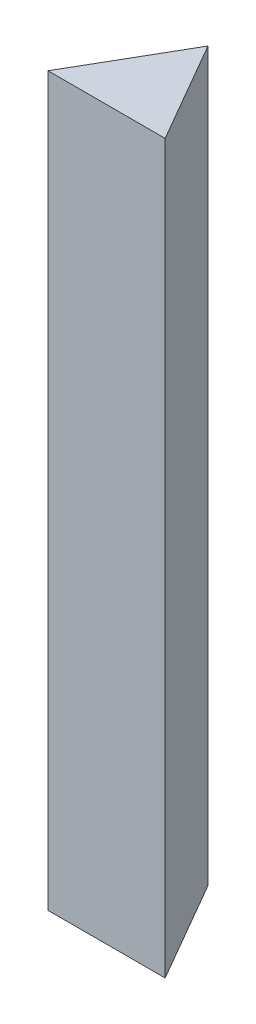
ISO-10303-21;
HEADER;
FILE_DESCRIPTION(('STEP AP214'),'2;1');
FILE_NAME('part.step','',(''),(''),'','','');
FILE_SCHEMA(('AUTOMOTIVE_DESIGN { 1 0 10303 214 1 1 1 1 }'));
ENDSEC;
DATA;
#1=APPLICATION_CONTEXT('core data for automotive mechanical design processes');
#2=APPLICATION_PROTOCOL_DEFINITION('international standard','automotive_design',2000,#1);
#3=PRODUCT_CONTEXT('',#1,'mechanical');
#4=PRODUCT('Part','Part','',(#3));
#5=PRODUCT_RELATED_PRODUCT_CATEGORY('part','',(#4));
#6=PRODUCT_DEFINITION_FORMATION('','',#4);
#7=PRODUCT_DEFINITION_CONTEXT('part definition',#1,'design');
#8=PRODUCT_DEFINITION('design','',#6,#7);
#9=PRODUCT_DEFINITION_SHAPE('','',#8);
#10=(LENGTH_UNIT() NAMED_UNIT(*) SI_UNIT(.MILLI.,.METRE.));
#11=(NAMED_UNIT(*) PLANE_ANGLE_UNIT() SI_UNIT($,.RADIAN.));
#12=(NAMED_UNIT(*) SI_UNIT($,.STERADIAN.) SOLID_ANGLE_UNIT());
#13=UNCERTAINTY_MEASURE_WITH_UNIT(LENGTH_MEASURE(1.E-05),#10,'distance_accuracy_value','');
#14=(GEOMETRIC_REPRESENTATION_CONTEXT(3) GLOBAL_UNCERTAINTY_ASSIGNED_CONTEXT((#13)) GLOBAL_UNIT_ASSIGNED_CONTEXT((#10,
#11,#12)) REPRESENTATION_CONTEXT('',''));
#15=CARTESIAN_POINT('',(0.,0.,0.));
#16=DIRECTION('',(0.,0.,1.));
#17=DIRECTION('',(1.,0.,0.));
#18=AXIS2_PLACEMENT_3D('',#15,#16,#17);
#19=CARTESIAN_POINT('',(2.4,29.8,0.));
#20=DIRECTION('',(0.,0.,-1.));
#21=DIRECTION('',(-1.,0.,0.));
#22=AXIS2_PLACEMENT_3D('',#19,#20,#21);
#23=PLANE('',#22);
#24=DIRECTION('',(1.,0.,0.));
#25=VECTOR('',#24,1.);
#26=CARTESIAN_POINT('',(2.4,0.,0.));
#27=LINE('',#26,#25);
#28=CARTESIAN_POINT('',(-2.4,0.,0.));
#29=VERTEX_POINT('',#28);
#30=CARTESIAN_POINT('',(2.4,0.,0.));
#31=VERTEX_POINT('',#30);
#32=EDGE_CURVE('E93',#29,#31,#27,.T.);
#33=ORIENTED_EDGE('',*,*,#32,.T.);
#34=DIRECTION('',(0.,-1.,0.));
#35=VECTOR('',#34,1.);
#36=CARTESIAN_POINT('',(2.4,29.8,0.));
#37=LINE('',#36,#35);
#38=CARTESIAN_POINT('',(2.4,29.8,0.));
#39=VERTEX_POINT('',#38);
#40=EDGE_CURVE('E11',#39,#31,#37,.T.);
#41=ORIENTED_EDGE('',*,*,#40,.F.);
#42=DIRECTION('',(1.,0.,0.));
#43=VECTOR('',#42,1.);
#44=CARTESIAN_POINT('',(2.4,29.8,0.));
#45=LINE('',#44,#43);
#46=CARTESIAN_POINT('',(-2.4,29.8,0.));
#47=VERTEX_POINT('',#46);
#48=EDGE_CURVE('E85',#47,#39,#45,.T.);
#49=ORIENTED_EDGE('',*,*,#48,.F.);
#50=DIRECTION('',(0.,-1.,0.));
#51=VECTOR('',#50,1.);
#52=CARTESIAN_POINT('',(-2.4,29.8,0.));
#53=LINE('',#52,#51);
#54=EDGE_CURVE('E94',#47,#29,#53,.T.);
#55=ORIENTED_EDGE('',*,*,#54,.T.);
#56=EDGE_LOOP('',(#33,#41,#49,#55));
#57=FACE_BOUND('',#56,.T.);
#58=ADVANCED_FACE('F43',(#57),#23,.F.);
#59=CARTESIAN_POINT('',(0.,29.8,-4.15692193816531));
#60=DIRECTION('',(-0.866025403784439,0.,0.5));
#61=DIRECTION('',(0.5,0.,0.866025403784439));
#62=AXIS2_PLACEMENT_3D('',#59,#60,#61);
#63=PLANE('',#62);
#64=DIRECTION('',(-0.5,0.,-0.866025403784439));
#65=VECTOR('',#64,1.);
#66=CARTESIAN_POINT('',(0.,0.,-4.15692193816531));
#67=LINE('',#66,#65);
#68=CARTESIAN_POINT('',(0.,0.,-4.15692193816531));
#69=VERTEX_POINT('',#68);
#70=EDGE_CURVE('E72',#31,#69,#67,.T.);
#71=ORIENTED_EDGE('',*,*,#70,.T.);
#72=DIRECTION('',(0.,-1.,0.));
#73=VECTOR('',#72,1.);
#74=CARTESIAN_POINT('',(0.,29.8,-4.15692193816531));
#75=LINE('',#74,#73);
#76=CARTESIAN_POINT('',(0.,29.8,-4.15692193816531));
#77=VERTEX_POINT('',#76);
#78=EDGE_CURVE('E52',#77,#69,#75,.T.);
#79=ORIENTED_EDGE('',*,*,#78,.F.);
#80=DIRECTION('',(-0.5,0.,-0.866025403784439));
#81=VECTOR('',#80,1.);
#82=CARTESIAN_POINT('',(0.,29.8,-4.15692193816531));
#83=LINE('',#82,#81);
#84=EDGE_CURVE('E80',#39,#77,#83,.T.);
#85=ORIENTED_EDGE('',*,*,#84,.F.);
#86=ORIENTED_EDGE('',*,*,#40,.T.);
#87=EDGE_LOOP('',(#71,#79,#85,#86));
#88=FACE_BOUND('',#87,.T.);
#89=ADVANCED_FACE('F81',(#88),#63,.F.);
#90=CARTESIAN_POINT('',(-2.4,29.8,0.));
#91=DIRECTION('',(0.866025403784439,0.,0.5));
#92=DIRECTION('',(0.5,0.,-0.866025403784439));
#93=AXIS2_PLACEMENT_3D('',#90,#91,#92);
#94=PLANE('',#93);
#95=DIRECTION('',(-0.5,0.,0.866025403784439));
#96=VECTOR('',#95,1.);
#97=CARTESIAN_POINT('',(-2.4,0.,0.));
#98=LINE('',#97,#96);
#99=EDGE_CURVE('E77',#69,#29,#98,.T.);
#100=ORIENTED_EDGE('',*,*,#99,.T.);
#101=ORIENTED_EDGE('',*,*,#54,.F.);
#102=DIRECTION('',(-0.5,0.,0.866025403784439));
#103=VECTOR('',#102,1.);
#104=CARTESIAN_POINT('',(-2.4,29.8,0.));
#105=LINE('',#104,#103);
#106=EDGE_CURVE('E60',#77,#47,#105,.T.);
#107=ORIENTED_EDGE('',*,*,#106,.F.);
#108=ORIENTED_EDGE('',*,*,#78,.T.);
#109=EDGE_LOOP('',(#100,#101,#107,#108));
#110=FACE_BOUND('',#109,.T.);
#111=ADVANCED_FACE('F106',(#110),#94,.F.);
#112=CARTESIAN_POINT('',(0.,29.8,0.));
#113=DIRECTION('',(0.,-1.,0.));
#114=DIRECTION('',(0.,0.,-1.));
#115=AXIS2_PLACEMENT_3D('',#112,#113,#114);
#116=PLANE('',#115);
#117=ORIENTED_EDGE('',*,*,#48,.T.);
#118=ORIENTED_EDGE('',*,*,#84,.T.);
#119=ORIENTED_EDGE('',*,*,#106,.T.);
#120=EDGE_LOOP('',(#117,#118,#119));
#121=FACE_BOUND('',#120,.T.);
#122=ADVANCED_FACE('F88',(#121),#116,.F.);
#123=CARTESIAN_POINT('',(0.,0.,0.));
#124=DIRECTION('',(0.,-1.,0.));
#125=DIRECTION('',(0.,0.,-1.));
#126=AXIS2_PLACEMENT_3D('',#123,#124,#125);
#127=PLANE('',#126);
#128=ORIENTED_EDGE('',*,*,#32,.F.);
#129=ORIENTED_EDGE('',*,*,#99,.F.);
#130=ORIENTED_EDGE('',*,*,#70,.F.);
#131=EDGE_LOOP('',(#128,#129,#130));
#132=FACE_BOUND('',#131,.T.);
#133=ADVANCED_FACE('F107',(#132),#127,.T.);
#134=CLOSED_SHELL('',(#58,#89,#111,#122,#133));
#135=MANIFOLD_SOLID_BREP('B2',#134);
#136=ADVANCED_BREP_SHAPE_REPRESENTATION('',(#18,#135),#14);
#137=SHAPE_DEFINITION_REPRESENTATION(#9,#136);
ENDSEC;
END-ISO-10303-21;
